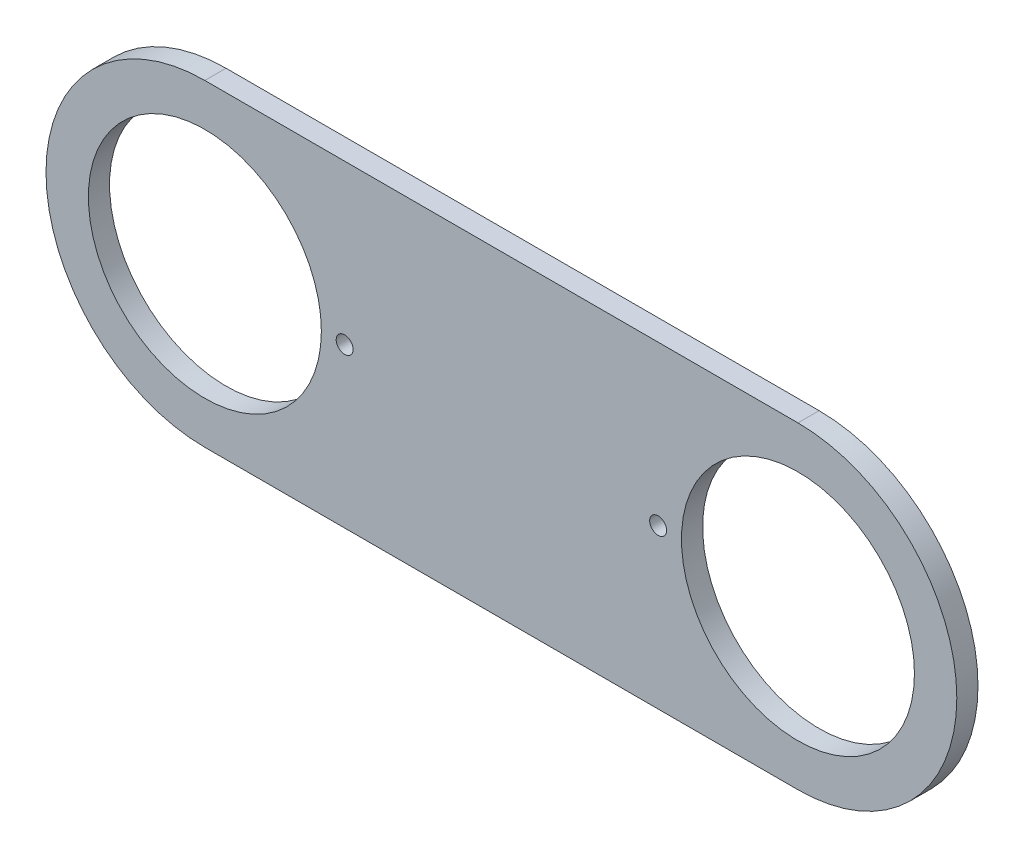
ISO-10303-21;
HEADER;
FILE_DESCRIPTION(('STEP AP214'),'2;1');
FILE_NAME('part.step','',(''),(''),'','','');
FILE_SCHEMA(('AUTOMOTIVE_DESIGN { 1 0 10303 214 1 1 1 1 }'));
ENDSEC;
DATA;
#1=APPLICATION_CONTEXT('core data for automotive mechanical design processes');
#2=APPLICATION_PROTOCOL_DEFINITION('international standard','automotive_design',2000,#1);
#3=PRODUCT_CONTEXT('',#1,'mechanical');
#4=PRODUCT('Part','Part','',(#3));
#5=PRODUCT_RELATED_PRODUCT_CATEGORY('part','',(#4));
#6=PRODUCT_DEFINITION_FORMATION('','',#4);
#7=PRODUCT_DEFINITION_CONTEXT('part definition',#1,'design');
#8=PRODUCT_DEFINITION('design','',#6,#7);
#9=PRODUCT_DEFINITION_SHAPE('','',#8);
#10=(LENGTH_UNIT() NAMED_UNIT(*) SI_UNIT(.MILLI.,.METRE.));
#11=(NAMED_UNIT(*) PLANE_ANGLE_UNIT() SI_UNIT($,.RADIAN.));
#12=(NAMED_UNIT(*) SI_UNIT($,.STERADIAN.) SOLID_ANGLE_UNIT());
#13=UNCERTAINTY_MEASURE_WITH_UNIT(LENGTH_MEASURE(1.E-05),#10,'distance_accuracy_value','');
#14=(GEOMETRIC_REPRESENTATION_CONTEXT(3) GLOBAL_UNCERTAINTY_ASSIGNED_CONTEXT((#13)) GLOBAL_UNIT_ASSIGNED_CONTEXT((#10,
#11,#12)) REPRESENTATION_CONTEXT('',''));
#15=CARTESIAN_POINT('',(0.,0.,0.));
#16=DIRECTION('',(0.,0.,1.));
#17=DIRECTION('',(1.,0.,0.));
#18=AXIS2_PLACEMENT_3D('',#15,#16,#17);
#19=CARTESIAN_POINT('',(0.,0.,5.));
#20=DIRECTION('',(0.,0.,1.));
#21=DIRECTION('',(1.,0.,0.));
#22=AXIS2_PLACEMENT_3D('',#19,#20,#21);
#23=PLANE('',#22);
#24=CARTESIAN_POINT('',(33.,0.,5.));
#25=DIRECTION('',(0.,0.,1.));
#26=DIRECTION('',(1.,0.,0.));
#27=AXIS2_PLACEMENT_3D('',#24,#25,#26);
#28=CIRCLE('',#27,2.);
#29=CARTESIAN_POINT('',(35.,0.,5.));
#30=VERTEX_POINT('',#29);
#31=EDGE_CURVE('E128',#30,#30,#28,.T.);
#32=ORIENTED_EDGE('',*,*,#31,.F.);
#33=EDGE_LOOP('',(#32));
#34=FACE_BOUND('',#33,.T.);
#35=CARTESIAN_POINT('',(0.,0.,5.));
#36=DIRECTION('',(0.,0.,1.));
#37=DIRECTION('',(1.,0.,0.));
#38=AXIS2_PLACEMENT_3D('',#35,#36,#37);
#39=CIRCLE('',#38,27.5);
#40=CARTESIAN_POINT('',(27.5,0.,5.));
#41=VERTEX_POINT('',#40);
#42=EDGE_CURVE('E107',#41,#41,#39,.T.);
#43=ORIENTED_EDGE('',*,*,#42,.F.);
#44=EDGE_LOOP('',(#43));
#45=FACE_BOUND('',#44,.T.);
#46=CARTESIAN_POINT('',(0.,0.,5.));
#47=DIRECTION('',(0.,0.,1.));
#48=DIRECTION('',(1.,0.,0.));
#49=AXIS2_PLACEMENT_3D('',#46,#47,#48);
#50=CIRCLE('',#49,37.5);
#51=CARTESIAN_POINT('',(0.,37.5,5.));
#52=VERTEX_POINT('',#51);
#53=CARTESIAN_POINT('',(0.,-37.5,5.));
#54=VERTEX_POINT('',#53);
#55=EDGE_CURVE('E92',#52,#54,#50,.T.);
#56=ORIENTED_EDGE('',*,*,#55,.T.);
#57=DIRECTION('',(1.,0.,0.));
#58=VECTOR('',#57,1.);
#59=CARTESIAN_POINT('',(0.,-37.5,5.));
#60=LINE('',#59,#58);
#61=CARTESIAN_POINT('',(140.,-37.5,5.));
#62=VERTEX_POINT('',#61);
#63=EDGE_CURVE('E87',#54,#62,#60,.T.);
#64=ORIENTED_EDGE('',*,*,#63,.T.);
#65=CARTESIAN_POINT('',(140.,0.,5.));
#66=DIRECTION('',(0.,0.,1.));
#67=DIRECTION('',(1.,0.,0.));
#68=AXIS2_PLACEMENT_3D('',#65,#66,#67);
#69=CIRCLE('',#68,37.5);
#70=CARTESIAN_POINT('',(140.,37.5,5.));
#71=VERTEX_POINT('',#70);
#72=EDGE_CURVE('E90',#62,#71,#69,.T.);
#73=ORIENTED_EDGE('',*,*,#72,.T.);
#74=DIRECTION('',(-1.,0.,0.));
#75=VECTOR('',#74,1.);
#76=CARTESIAN_POINT('',(0.,37.5,5.));
#77=LINE('',#76,#75);
#78=EDGE_CURVE('E57',#71,#52,#77,.T.);
#79=ORIENTED_EDGE('',*,*,#78,.T.);
#80=EDGE_LOOP('',(#56,#64,#73,#79));
#81=FACE_BOUND('',#80,.T.);
#82=CARTESIAN_POINT('',(140.,0.,5.));
#83=DIRECTION('',(0.,0.,1.));
#84=DIRECTION('',(1.,0.,0.));
#85=AXIS2_PLACEMENT_3D('',#82,#83,#84);
#86=CIRCLE('',#85,27.5);
#87=CARTESIAN_POINT('',(167.5,0.,5.));
#88=VERTEX_POINT('',#87);
#89=EDGE_CURVE('E122',#88,#88,#86,.T.);
#90=ORIENTED_EDGE('',*,*,#89,.F.);
#91=EDGE_LOOP('',(#90));
#92=FACE_BOUND('',#91,.T.);
#93=CARTESIAN_POINT('',(107.,0.,5.));
#94=DIRECTION('',(0.,0.,1.));
#95=DIRECTION('',(1.,0.,0.));
#96=AXIS2_PLACEMENT_3D('',#93,#94,#95);
#97=CIRCLE('',#96,2.);
#98=CARTESIAN_POINT('',(109.,0.,5.));
#99=VERTEX_POINT('',#98);
#100=EDGE_CURVE('E134',#99,#99,#97,.T.);
#101=ORIENTED_EDGE('',*,*,#100,.F.);
#102=EDGE_LOOP('',(#101));
#103=FACE_BOUND('',#102,.T.);
#104=ADVANCED_FACE('F40',(#34,#45,#81,#92,#103),#23,.T.);
#105=CARTESIAN_POINT('',(0.,0.,0.));
#106=DIRECTION('',(0.,0.,1.));
#107=DIRECTION('',(1.,0.,0.));
#108=AXIS2_PLACEMENT_3D('',#105,#106,#107);
#109=PLANE('',#108);
#110=CARTESIAN_POINT('',(0.,0.,0.));
#111=DIRECTION('',(0.,0.,1.));
#112=DIRECTION('',(1.,0.,0.));
#113=AXIS2_PLACEMENT_3D('',#110,#111,#112);
#114=CIRCLE('',#113,37.5);
#115=CARTESIAN_POINT('',(0.,37.5,0.));
#116=VERTEX_POINT('',#115);
#117=CARTESIAN_POINT('',(0.,-37.5,0.));
#118=VERTEX_POINT('',#117);
#119=EDGE_CURVE('E104',#116,#118,#114,.T.);
#120=ORIENTED_EDGE('',*,*,#119,.F.);
#121=DIRECTION('',(-1.,0.,0.));
#122=VECTOR('',#121,1.);
#123=CARTESIAN_POINT('',(0.,37.5,0.));
#124=LINE('',#123,#122);
#125=CARTESIAN_POINT('',(140.,37.5,0.));
#126=VERTEX_POINT('',#125);
#127=EDGE_CURVE('E80',#126,#116,#124,.T.);
#128=ORIENTED_EDGE('',*,*,#127,.F.);
#129=CARTESIAN_POINT('',(140.,0.,0.));
#130=DIRECTION('',(0.,0.,1.));
#131=DIRECTION('',(1.,0.,0.));
#132=AXIS2_PLACEMENT_3D('',#129,#130,#131);
#133=CIRCLE('',#132,37.5);
#134=CARTESIAN_POINT('',(140.,-37.5,0.));
#135=VERTEX_POINT('',#134);
#136=EDGE_CURVE('E74',#135,#126,#133,.T.);
#137=ORIENTED_EDGE('',*,*,#136,.F.);
#138=DIRECTION('',(1.,0.,0.));
#139=VECTOR('',#138,1.);
#140=CARTESIAN_POINT('',(0.,-37.5,0.));
#141=LINE('',#140,#139);
#142=EDGE_CURVE('E96',#118,#135,#141,.T.);
#143=ORIENTED_EDGE('',*,*,#142,.F.);
#144=EDGE_LOOP('',(#120,#128,#137,#143));
#145=FACE_BOUND('',#144,.T.);
#146=CARTESIAN_POINT('',(0.,0.,0.));
#147=DIRECTION('',(0.,0.,1.));
#148=DIRECTION('',(1.,0.,0.));
#149=AXIS2_PLACEMENT_3D('',#146,#147,#148);
#150=CIRCLE('',#149,27.5);
#151=CARTESIAN_POINT('',(27.5,0.,0.));
#152=VERTEX_POINT('',#151);
#153=EDGE_CURVE('E119',#152,#152,#150,.T.);
#154=ORIENTED_EDGE('',*,*,#153,.T.);
#155=EDGE_LOOP('',(#154));
#156=FACE_BOUND('',#155,.T.);
#157=CARTESIAN_POINT('',(140.,0.,0.));
#158=DIRECTION('',(0.,0.,1.));
#159=DIRECTION('',(1.,0.,0.));
#160=AXIS2_PLACEMENT_3D('',#157,#158,#159);
#161=CIRCLE('',#160,27.5);
#162=CARTESIAN_POINT('',(167.5,0.,0.));
#163=VERTEX_POINT('',#162);
#164=EDGE_CURVE('E125',#163,#163,#161,.T.);
#165=ORIENTED_EDGE('',*,*,#164,.T.);
#166=EDGE_LOOP('',(#165));
#167=FACE_BOUND('',#166,.T.);
#168=CARTESIAN_POINT('',(33.,0.,0.));
#169=DIRECTION('',(0.,0.,1.));
#170=DIRECTION('',(1.,0.,0.));
#171=AXIS2_PLACEMENT_3D('',#168,#169,#170);
#172=CIRCLE('',#171,2.);
#173=CARTESIAN_POINT('',(35.,0.,0.));
#174=VERTEX_POINT('',#173);
#175=EDGE_CURVE('E131',#174,#174,#172,.T.);
#176=ORIENTED_EDGE('',*,*,#175,.T.);
#177=EDGE_LOOP('',(#176));
#178=FACE_BOUND('',#177,.T.);
#179=CARTESIAN_POINT('',(107.,0.,0.));
#180=DIRECTION('',(0.,0.,1.));
#181=DIRECTION('',(1.,0.,0.));
#182=AXIS2_PLACEMENT_3D('',#179,#180,#181);
#183=CIRCLE('',#182,2.);
#184=CARTESIAN_POINT('',(109.,0.,0.));
#185=VERTEX_POINT('',#184);
#186=EDGE_CURVE('E137',#185,#185,#183,.T.);
#187=ORIENTED_EDGE('',*,*,#186,.T.);
#188=EDGE_LOOP('',(#187));
#189=FACE_BOUND('',#188,.T.);
#190=ADVANCED_FACE('F115',(#145,#156,#167,#178,#189),#109,.F.);
#191=CARTESIAN_POINT('',(0.,0.,5.));
#192=DIRECTION('',(0.,0.,-1.));
#193=DIRECTION('',(-1.,0.,0.));
#194=AXIS2_PLACEMENT_3D('',#191,#192,#193);
#195=CYLINDRICAL_SURFACE('',#194,37.5);
#196=ORIENTED_EDGE('',*,*,#119,.T.);
#197=DIRECTION('',(0.,0.,-1.));
#198=VECTOR('',#197,1.);
#199=CARTESIAN_POINT('',(0.,-37.5,5.));
#200=LINE('',#199,#198);
#201=EDGE_CURVE('E11',#54,#118,#200,.T.);
#202=ORIENTED_EDGE('',*,*,#201,.F.);
#203=ORIENTED_EDGE('',*,*,#55,.F.);
#204=DIRECTION('',(0.,0.,-1.));
#205=VECTOR('',#204,1.);
#206=CARTESIAN_POINT('',(0.,37.5,5.));
#207=LINE('',#206,#205);
#208=EDGE_CURVE('E100',#52,#116,#207,.T.);
#209=ORIENTED_EDGE('',*,*,#208,.T.);
#210=EDGE_LOOP('',(#196,#202,#203,#209));
#211=FACE_BOUND('',#210,.T.);
#212=ADVANCED_FACE('F42',(#211),#195,.T.);
#213=CARTESIAN_POINT('',(0.,-37.5,5.));
#214=DIRECTION('',(0.,1.,0.));
#215=DIRECTION('',(0.,0.,1.));
#216=AXIS2_PLACEMENT_3D('',#213,#214,#215);
#217=PLANE('',#216);
#218=ORIENTED_EDGE('',*,*,#142,.T.);
#219=DIRECTION('',(0.,0.,-1.));
#220=VECTOR('',#219,1.);
#221=CARTESIAN_POINT('',(140.,-37.5,5.));
#222=LINE('',#221,#220);
#223=EDGE_CURVE('E49',#62,#135,#222,.T.);
#224=ORIENTED_EDGE('',*,*,#223,.F.);
#225=ORIENTED_EDGE('',*,*,#63,.F.);
#226=ORIENTED_EDGE('',*,*,#201,.T.);
#227=EDGE_LOOP('',(#218,#224,#225,#226));
#228=FACE_BOUND('',#227,.T.);
#229=ADVANCED_FACE('F95',(#228),#217,.F.);
#230=CARTESIAN_POINT('',(140.,0.,5.));
#231=DIRECTION('',(0.,0.,-1.));
#232=DIRECTION('',(-1.,0.,0.));
#233=AXIS2_PLACEMENT_3D('',#230,#231,#232);
#234=CYLINDRICAL_SURFACE('',#233,37.5);
#235=ORIENTED_EDGE('',*,*,#136,.T.);
#236=DIRECTION('',(0.,0.,-1.));
#237=VECTOR('',#236,1.);
#238=CARTESIAN_POINT('',(140.,37.5,5.));
#239=LINE('',#238,#237);
#240=EDGE_CURVE('E97',#71,#126,#239,.T.);
#241=ORIENTED_EDGE('',*,*,#240,.F.);
#242=ORIENTED_EDGE('',*,*,#72,.F.);
#243=ORIENTED_EDGE('',*,*,#223,.T.);
#244=EDGE_LOOP('',(#235,#241,#242,#243));
#245=FACE_BOUND('',#244,.T.);
#246=ADVANCED_FACE('F98',(#245),#234,.T.);
#247=CARTESIAN_POINT('',(0.,37.5,5.));
#248=DIRECTION('',(0.,-1.,0.));
#249=DIRECTION('',(1.,0.,0.));
#250=AXIS2_PLACEMENT_3D('',#247,#248,#249);
#251=PLANE('',#250);
#252=ORIENTED_EDGE('',*,*,#127,.T.);
#253=ORIENTED_EDGE('',*,*,#208,.F.);
#254=ORIENTED_EDGE('',*,*,#78,.F.);
#255=ORIENTED_EDGE('',*,*,#240,.T.);
#256=EDGE_LOOP('',(#252,#253,#254,#255));
#257=FACE_BOUND('',#256,.T.);
#258=ADVANCED_FACE('F112',(#257),#251,.F.);
#259=CARTESIAN_POINT('',(0.,0.,5.));
#260=DIRECTION('',(0.,0.,-1.));
#261=DIRECTION('',(-1.,0.,0.));
#262=AXIS2_PLACEMENT_3D('',#259,#260,#261);
#263=CYLINDRICAL_SURFACE('',#262,27.5);
#264=ORIENTED_EDGE('',*,*,#42,.T.);
#265=EDGE_LOOP('',(#264));
#266=FACE_BOUND('',#265,.T.);
#267=ORIENTED_EDGE('',*,*,#153,.F.);
#268=EDGE_LOOP('',(#267));
#269=FACE_BOUND('',#268,.T.);
#270=ADVANCED_FACE('F156',(#266,#269),#263,.F.);
#271=CARTESIAN_POINT('',(140.,0.,5.));
#272=DIRECTION('',(0.,0.,-1.));
#273=DIRECTION('',(-1.,0.,0.));
#274=AXIS2_PLACEMENT_3D('',#271,#272,#273);
#275=CYLINDRICAL_SURFACE('',#274,27.5);
#276=ORIENTED_EDGE('',*,*,#89,.T.);
#277=EDGE_LOOP('',(#276));
#278=FACE_BOUND('',#277,.T.);
#279=ORIENTED_EDGE('',*,*,#164,.F.);
#280=EDGE_LOOP('',(#279));
#281=FACE_BOUND('',#280,.T.);
#282=ADVANCED_FACE('F210',(#278,#281),#275,.F.);
#283=CARTESIAN_POINT('',(33.,0.,5.));
#284=DIRECTION('',(0.,0.,-1.));
#285=DIRECTION('',(-1.,0.,0.));
#286=AXIS2_PLACEMENT_3D('',#283,#284,#285);
#287=CYLINDRICAL_SURFACE('',#286,2.);
#288=ORIENTED_EDGE('',*,*,#31,.T.);
#289=EDGE_LOOP('',(#288));
#290=FACE_BOUND('',#289,.T.);
#291=ORIENTED_EDGE('',*,*,#175,.F.);
#292=EDGE_LOOP('',(#291));
#293=FACE_BOUND('',#292,.T.);
#294=ADVANCED_FACE('F219',(#290,#293),#287,.F.);
#295=CARTESIAN_POINT('',(107.,0.,5.));
#296=DIRECTION('',(0.,0.,-1.));
#297=DIRECTION('',(-1.,0.,0.));
#298=AXIS2_PLACEMENT_3D('',#295,#296,#297);
#299=CYLINDRICAL_SURFACE('',#298,2.);
#300=ORIENTED_EDGE('',*,*,#100,.T.);
#301=EDGE_LOOP('',(#300));
#302=FACE_BOUND('',#301,.T.);
#303=ORIENTED_EDGE('',*,*,#186,.F.);
#304=EDGE_LOOP('',(#303));
#305=FACE_BOUND('',#304,.T.);
#306=ADVANCED_FACE('F143',(#302,#305),#299,.F.);
#307=CLOSED_SHELL('',(#104,#190,#212,#229,#246,#258,#270,#282,#294,#306));
#308=MANIFOLD_SOLID_BREP('B2',#307);
#309=ADVANCED_BREP_SHAPE_REPRESENTATION('',(#18,#308),#14);
#310=SHAPE_DEFINITION_REPRESENTATION(#9,#309);
ENDSEC;
END-ISO-10303-21;
